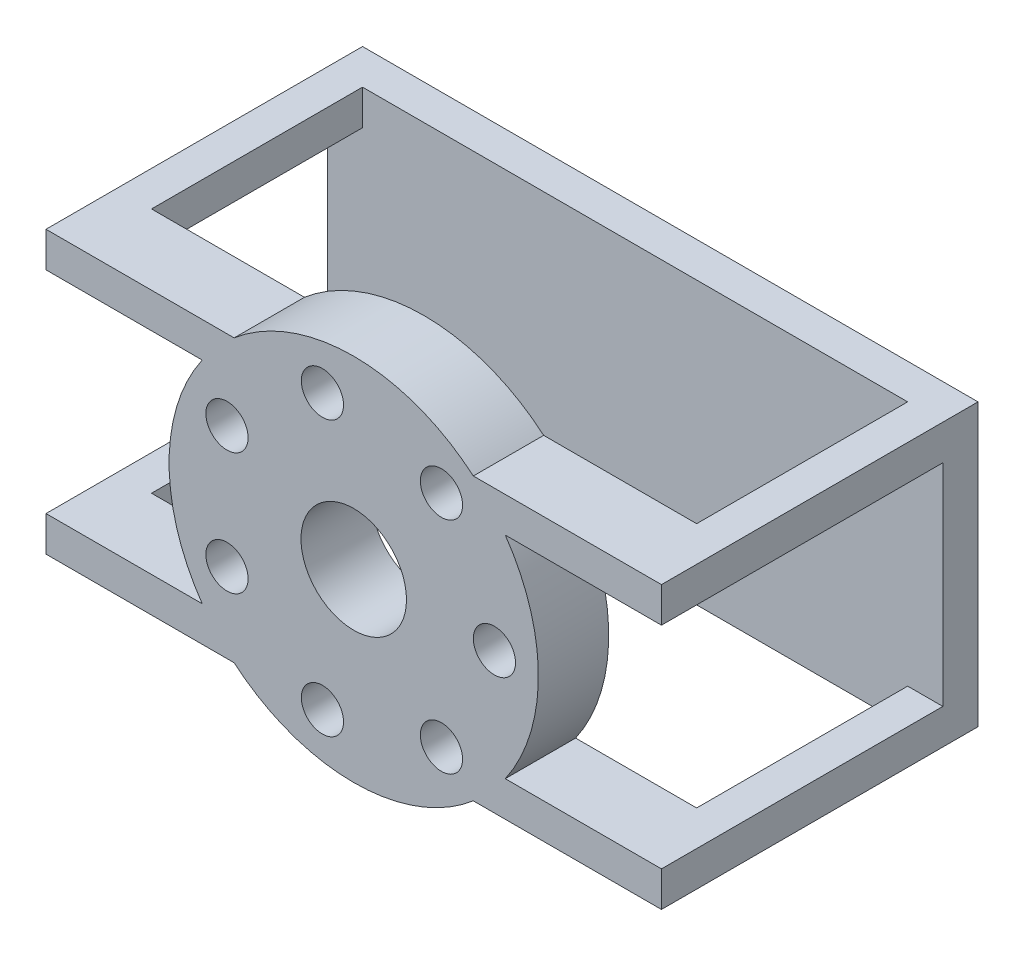
ISO-10303-21;
HEADER;
FILE_DESCRIPTION(('STEP AP214'),'2;1');
FILE_NAME('part.step','',(''),(''),'','','');
FILE_SCHEMA(('AUTOMOTIVE_DESIGN { 1 0 10303 214 1 1 1 1 }'));
ENDSEC;
DATA;
#1=APPLICATION_CONTEXT('core data for automotive mechanical design processes');
#2=APPLICATION_PROTOCOL_DEFINITION('international standard','automotive_design',2000,#1);
#3=PRODUCT_CONTEXT('',#1,'mechanical');
#4=PRODUCT('Part','Part','',(#3));
#5=PRODUCT_RELATED_PRODUCT_CATEGORY('part','',(#4));
#6=PRODUCT_DEFINITION_FORMATION('','',#4);
#7=PRODUCT_DEFINITION_CONTEXT('part definition',#1,'design');
#8=PRODUCT_DEFINITION('design','',#6,#7);
#9=PRODUCT_DEFINITION_SHAPE('','',#8);
#10=(LENGTH_UNIT() NAMED_UNIT(*) SI_UNIT(.MILLI.,.METRE.));
#11=(NAMED_UNIT(*) PLANE_ANGLE_UNIT() SI_UNIT($,.RADIAN.));
#12=(NAMED_UNIT(*) SI_UNIT($,.STERADIAN.) SOLID_ANGLE_UNIT());
#13=UNCERTAINTY_MEASURE_WITH_UNIT(LENGTH_MEASURE(1.E-05),#10,'distance_accuracy_value','');
#14=(GEOMETRIC_REPRESENTATION_CONTEXT(3) GLOBAL_UNCERTAINTY_ASSIGNED_CONTEXT((#13)) GLOBAL_UNIT_ASSIGNED_CONTEXT((#10,
#11,#12)) REPRESENTATION_CONTEXT('',''));
#15=CARTESIAN_POINT('',(0.,0.,0.));
#16=DIRECTION('',(0.,0.,1.));
#17=DIRECTION('',(1.,0.,0.));
#18=AXIS2_PLACEMENT_3D('',#15,#16,#17);
#19=CARTESIAN_POINT('',(87.5,52.5,0.));
#20=DIRECTION('',(0.,0.,-1.));
#21=DIRECTION('',(-1.,0.,0.));
#22=AXIS2_PLACEMENT_3D('',#19,#20,#21);
#23=PLANE('',#22);
#24=CARTESIAN_POINT('',(24.9395920743493,-31.2732592987212,0.));
#25=DIRECTION('',(0.,0.,1.));
#26=DIRECTION('',(1.,0.,0.));
#27=AXIS2_PLACEMENT_3D('',#24,#25,#26);
#28=CIRCLE('',#27,5.99999999999999);
#29=CARTESIAN_POINT('',(30.9395920743493,-31.2732592987212,0.));
#30=VERTEX_POINT('',#29);
#31=EDGE_CURVE('E500',#30,#30,#28,.T.);
#32=ORIENTED_EDGE('',*,*,#31,.F.);
#33=EDGE_LOOP('',(#32));
#34=FACE_BOUND('',#33,.T.);
#35=CARTESIAN_POINT('',(-8.90083735825273,-38.9971164872729,0.));
#36=DIRECTION('',(0.,0.,1.));
#37=DIRECTION('',(1.,0.,0.));
#38=AXIS2_PLACEMENT_3D('',#35,#36,#37);
#39=CIRCLE('',#38,6.);
#40=CARTESIAN_POINT('',(-2.90083735825273,-38.9971164872729,0.));
#41=VERTEX_POINT('',#40);
#42=EDGE_CURVE('E508',#41,#41,#39,.T.);
#43=ORIENTED_EDGE('',*,*,#42,.F.);
#44=EDGE_LOOP('',(#43));
#45=FACE_BOUND('',#44,.T.);
#46=CARTESIAN_POINT('',(-36.0387547160968,-17.3553495647023,0.));
#47=DIRECTION('',(0.,0.,1.));
#48=DIRECTION('',(1.,0.,0.));
#49=AXIS2_PLACEMENT_3D('',#46,#47,#48);
#50=CIRCLE('',#49,5.99999999999994);
#51=CARTESIAN_POINT('',(-30.0387547160968,-17.3553495647023,0.));
#52=VERTEX_POINT('',#51);
#53=EDGE_CURVE('E505',#52,#52,#50,.T.);
#54=ORIENTED_EDGE('',*,*,#53,.F.);
#55=EDGE_LOOP('',(#54));
#56=FACE_BOUND('',#55,.T.);
#57=CARTESIAN_POINT('',(40.,0.,0.));
#58=DIRECTION('',(0.,0.,1.));
#59=DIRECTION('',(1.,0.,0.));
#60=AXIS2_PLACEMENT_3D('',#57,#58,#59);
#61=CIRCLE('',#60,5.99999999999999);
#62=CARTESIAN_POINT('',(46.,0.,0.));
#63=VERTEX_POINT('',#62);
#64=EDGE_CURVE('E501',#63,#63,#61,.T.);
#65=ORIENTED_EDGE('',*,*,#64,.F.);
#66=EDGE_LOOP('',(#65));
#67=FACE_BOUND('',#66,.T.);
#68=CARTESIAN_POINT('',(-8.9008373582522,38.997116487273,0.));
#69=DIRECTION('',(0.,0.,1.));
#70=DIRECTION('',(1.,0.,0.));
#71=AXIS2_PLACEMENT_3D('',#68,#69,#70);
#72=CIRCLE('',#71,5.99999999999999);
#73=CARTESIAN_POINT('',(-2.90083735825221,38.997116487273,0.));
#74=VERTEX_POINT('',#73);
#75=EDGE_CURVE('E516',#74,#74,#72,.T.);
#76=ORIENTED_EDGE('',*,*,#75,.F.);
#77=EDGE_LOOP('',(#76));
#78=FACE_BOUND('',#77,.T.);
#79=CARTESIAN_POINT('',(24.9395920743497,31.2732592987209,0.));
#80=DIRECTION('',(0.,0.,1.));
#81=DIRECTION('',(1.,0.,0.));
#82=AXIS2_PLACEMENT_3D('',#79,#80,#81);
#83=CIRCLE('',#82,5.99999999999999);
#84=CARTESIAN_POINT('',(30.9395920743497,31.2732592987209,0.));
#85=VERTEX_POINT('',#84);
#86=EDGE_CURVE('E513',#85,#85,#83,.T.);
#87=ORIENTED_EDGE('',*,*,#86,.F.);
#88=EDGE_LOOP('',(#87));
#89=FACE_BOUND('',#88,.T.);
#90=CARTESIAN_POINT('',(-36.0387547160966,17.3553495647026,0.));
#91=DIRECTION('',(0.,0.,1.));
#92=DIRECTION('',(1.,0.,0.));
#93=AXIS2_PLACEMENT_3D('',#90,#91,#92);
#94=CIRCLE('',#93,6.);
#95=CARTESIAN_POINT('',(-30.0387547160966,17.3553495647026,0.));
#96=VERTEX_POINT('',#95);
#97=EDGE_CURVE('E504',#96,#96,#94,.T.);
#98=ORIENTED_EDGE('',*,*,#97,.F.);
#99=EDGE_LOOP('',(#98));
#100=FACE_BOUND('',#99,.T.);
#101=CARTESIAN_POINT('',(0.,0.,0.));
#102=DIRECTION('',(0.,0.,1.));
#103=DIRECTION('',(1.,0.,0.));
#104=AXIS2_PLACEMENT_3D('',#101,#102,#103);
#105=CIRCLE('',#104,15.);
#106=CARTESIAN_POINT('',(15.,0.,0.));
#107=VERTEX_POINT('',#106);
#108=EDGE_CURVE('E497',#107,#107,#105,.T.);
#109=ORIENTED_EDGE('',*,*,#108,.F.);
#110=EDGE_LOOP('',(#109));
#111=FACE_BOUND('',#110,.T.);
#112=DIRECTION('',(-1.,0.,0.));
#113=VECTOR('',#112,1.);
#114=CARTESIAN_POINT('',(0.,40.,0.));
#115=LINE('',#114,#113);
#116=CARTESIAN_POINT('',(87.5,40.,0.));
#117=VERTEX_POINT('',#116);
#118=CARTESIAN_POINT('',(34.0036762718386,40.,0.));
#119=VERTEX_POINT('',#118);
#120=EDGE_CURVE('E551',#117,#119,#115,.T.);
#121=ORIENTED_EDGE('',*,*,#120,.T.);
#122=CARTESIAN_POINT('',(0.,0.,0.));
#123=DIRECTION('',(0.,0.,1.));
#124=DIRECTION('',(1.,0.,0.));
#125=AXIS2_PLACEMENT_3D('',#122,#123,#124);
#126=CIRCLE('',#125,52.5);
#127=CARTESIAN_POINT('',(-34.0036762718386,40.,0.));
#128=VERTEX_POINT('',#127);
#129=EDGE_CURVE('E368',#119,#128,#126,.T.);
#130=ORIENTED_EDGE('',*,*,#129,.T.);
#131=DIRECTION('',(1.,0.,0.));
#132=VECTOR('',#131,1.);
#133=CARTESIAN_POINT('',(0.,40.,0.));
#134=LINE('',#133,#132);
#135=CARTESIAN_POINT('',(-87.5,40.,0.));
#136=VERTEX_POINT('',#135);
#137=EDGE_CURVE('E309',#136,#128,#134,.T.);
#138=ORIENTED_EDGE('',*,*,#137,.F.);
#139=DIRECTION('',(0.,-1.,0.));
#140=VECTOR('',#139,1.);
#141=CARTESIAN_POINT('',(-87.5,52.5,0.));
#142=LINE('',#141,#140);
#143=CARTESIAN_POINT('',(-87.5,30.,0.));
#144=VERTEX_POINT('',#143);
#145=EDGE_CURVE('E14',#136,#144,#142,.T.);
#146=ORIENTED_EDGE('',*,*,#145,.T.);
#147=DIRECTION('',(1.,0.,0.));
#148=VECTOR('',#147,1.);
#149=CARTESIAN_POINT('',(0.,30.,0.));
#150=LINE('',#149,#148);
#151=CARTESIAN_POINT('',(-43.0842198490352,30.,0.));
#152=VERTEX_POINT('',#151);
#153=EDGE_CURVE('E529',#144,#152,#150,.T.);
#154=ORIENTED_EDGE('',*,*,#153,.T.);
#155=CARTESIAN_POINT('',(0.,0.,0.));
#156=DIRECTION('',(0.,0.,1.));
#157=DIRECTION('',(1.,0.,0.));
#158=AXIS2_PLACEMENT_3D('',#155,#156,#157);
#159=CIRCLE('',#158,52.5);
#160=CARTESIAN_POINT('',(-43.0842198490352,-30.,0.));
#161=VERTEX_POINT('',#160);
#162=EDGE_CURVE('E152',#152,#161,#159,.T.);
#163=ORIENTED_EDGE('',*,*,#162,.T.);
#164=DIRECTION('',(1.,0.,0.));
#165=VECTOR('',#164,1.);
#166=CARTESIAN_POINT('',(0.,-30.,0.));
#167=LINE('',#166,#165);
#168=CARTESIAN_POINT('',(-87.5,-30.,0.));
#169=VERTEX_POINT('',#168);
#170=EDGE_CURVE('E522',#169,#161,#167,.T.);
#171=ORIENTED_EDGE('',*,*,#170,.F.);
#172=CARTESIAN_POINT('',(-87.5,-40.,0.));
#173=VERTEX_POINT('',#172);
#174=EDGE_CURVE('E141',#169,#173,#142,.T.);
#175=ORIENTED_EDGE('',*,*,#174,.T.);
#176=DIRECTION('',(1.,0.,0.));
#177=VECTOR('',#176,1.);
#178=CARTESIAN_POINT('',(0.,-40.,0.));
#179=LINE('',#178,#177);
#180=CARTESIAN_POINT('',(-34.0036762718386,-40.,0.));
#181=VERTEX_POINT('',#180);
#182=EDGE_CURVE('E320',#173,#181,#179,.T.);
#183=ORIENTED_EDGE('',*,*,#182,.T.);
#184=CARTESIAN_POINT('',(0.,0.,0.));
#185=DIRECTION('',(0.,0.,1.));
#186=DIRECTION('',(1.,0.,0.));
#187=AXIS2_PLACEMENT_3D('',#184,#185,#186);
#188=CIRCLE('',#187,52.5);
#189=CARTESIAN_POINT('',(34.0036762718386,-40.,0.));
#190=VERTEX_POINT('',#189);
#191=EDGE_CURVE('E359',#181,#190,#188,.T.);
#192=ORIENTED_EDGE('',*,*,#191,.T.);
#193=DIRECTION('',(-1.,0.,0.));
#194=VECTOR('',#193,1.);
#195=CARTESIAN_POINT('',(0.,-40.,0.));
#196=LINE('',#195,#194);
#197=CARTESIAN_POINT('',(87.5,-40.,0.));
#198=VERTEX_POINT('',#197);
#199=EDGE_CURVE('E357',#198,#190,#196,.T.);
#200=ORIENTED_EDGE('',*,*,#199,.F.);
#201=DIRECTION('',(0.,-1.,0.));
#202=VECTOR('',#201,1.);
#203=CARTESIAN_POINT('',(87.5,52.5,0.));
#204=LINE('',#203,#202);
#205=CARTESIAN_POINT('',(87.5,-30.,0.));
#206=VERTEX_POINT('',#205);
#207=EDGE_CURVE('E330',#206,#198,#204,.T.);
#208=ORIENTED_EDGE('',*,*,#207,.F.);
#209=DIRECTION('',(-1.,0.,0.));
#210=VECTOR('',#209,1.);
#211=CARTESIAN_POINT('',(0.,-30.,0.));
#212=LINE('',#211,#210);
#213=CARTESIAN_POINT('',(43.0842198490352,-30.,0.));
#214=VERTEX_POINT('',#213);
#215=EDGE_CURVE('E354',#206,#214,#212,.T.);
#216=ORIENTED_EDGE('',*,*,#215,.T.);
#217=CARTESIAN_POINT('',(0.,0.,0.));
#218=DIRECTION('',(0.,0.,1.));
#219=DIRECTION('',(1.,0.,0.));
#220=AXIS2_PLACEMENT_3D('',#217,#218,#219);
#221=CIRCLE('',#220,52.5);
#222=CARTESIAN_POINT('',(43.0842198490352,30.,0.));
#223=VERTEX_POINT('',#222);
#224=EDGE_CURVE('E378',#214,#223,#221,.T.);
#225=ORIENTED_EDGE('',*,*,#224,.T.);
#226=DIRECTION('',(-1.,0.,0.));
#227=VECTOR('',#226,1.);
#228=CARTESIAN_POINT('',(0.,30.,0.));
#229=LINE('',#228,#227);
#230=CARTESIAN_POINT('',(87.5,30.,0.));
#231=VERTEX_POINT('',#230);
#232=EDGE_CURVE('E372',#231,#223,#229,.T.);
#233=ORIENTED_EDGE('',*,*,#232,.F.);
#234=EDGE_CURVE('E336',#117,#231,#204,.T.);
#235=ORIENTED_EDGE('',*,*,#234,.F.);
#236=EDGE_LOOP('',(#121,#130,#138,#146,#154,#163,#171,#175,#183,#192,#200,#208,#216,#225,#233,#235));
#237=FACE_BOUND('',#236,.T.);
#238=ADVANCED_FACE('F137',(#34,#45,#56,#67,#78,#89,#100,#111,#237),#23,.F.);
#239=CARTESIAN_POINT('',(77.5,52.5,-20.));
#240=DIRECTION('',(0.,0.,-1.));
#241=DIRECTION('',(-1.,0.,0.));
#242=AXIS2_PLACEMENT_3D('',#239,#240,#241);
#243=PLANE('',#242);
#244=CARTESIAN_POINT('',(24.9395920743493,-31.2732592987212,-20.));
#245=DIRECTION('',(0.,0.,-1.));
#246=DIRECTION('',(-1.,0.,0.));
#247=AXIS2_PLACEMENT_3D('',#244,#245,#246);
#248=CIRCLE('',#247,5.99999999999999);
#249=CARTESIAN_POINT('',(18.9395920743493,-31.2732592987212,-20.));
#250=VERTEX_POINT('',#249);
#251=EDGE_CURVE('E451',#250,#250,#248,.T.);
#252=ORIENTED_EDGE('',*,*,#251,.F.);
#253=EDGE_LOOP('',(#252));
#254=FACE_BOUND('',#253,.T.);
#255=CARTESIAN_POINT('',(-8.90083735825273,-38.9971164872729,-20.));
#256=DIRECTION('',(0.,0.,-1.));
#257=DIRECTION('',(-1.,0.,0.));
#258=AXIS2_PLACEMENT_3D('',#255,#256,#257);
#259=CIRCLE('',#258,6.);
#260=CARTESIAN_POINT('',(-14.9008373582527,-38.9971164872729,-20.));
#261=VERTEX_POINT('',#260);
#262=EDGE_CURVE('E448',#261,#261,#259,.T.);
#263=ORIENTED_EDGE('',*,*,#262,.F.);
#264=EDGE_LOOP('',(#263));
#265=FACE_BOUND('',#264,.T.);
#266=CARTESIAN_POINT('',(-36.0387547160968,-17.3553495647023,-20.));
#267=DIRECTION('',(0.,0.,-1.));
#268=DIRECTION('',(-1.,0.,0.));
#269=AXIS2_PLACEMENT_3D('',#266,#267,#268);
#270=CIRCLE('',#269,5.99999999999994);
#271=CARTESIAN_POINT('',(-42.0387547160967,-17.3553495647023,-20.));
#272=VERTEX_POINT('',#271);
#273=EDGE_CURVE('E445',#272,#272,#270,.T.);
#274=ORIENTED_EDGE('',*,*,#273,.F.);
#275=EDGE_LOOP('',(#274));
#276=FACE_BOUND('',#275,.T.);
#277=CARTESIAN_POINT('',(40.,0.,-20.));
#278=DIRECTION('',(0.,0.,-1.));
#279=DIRECTION('',(-1.,0.,0.));
#280=AXIS2_PLACEMENT_3D('',#277,#278,#279);
#281=CIRCLE('',#280,5.99999999999999);
#282=CARTESIAN_POINT('',(34.,0.,-20.));
#283=VERTEX_POINT('',#282);
#284=EDGE_CURVE('E442',#283,#283,#281,.T.);
#285=ORIENTED_EDGE('',*,*,#284,.F.);
#286=EDGE_LOOP('',(#285));
#287=FACE_BOUND('',#286,.T.);
#288=CARTESIAN_POINT('',(-8.9008373582522,38.997116487273,-20.));
#289=DIRECTION('',(0.,0.,-1.));
#290=DIRECTION('',(-1.,0.,0.));
#291=AXIS2_PLACEMENT_3D('',#288,#289,#290);
#292=CIRCLE('',#291,5.99999999999999);
#293=CARTESIAN_POINT('',(-14.9008373582522,38.997116487273,-20.));
#294=VERTEX_POINT('',#293);
#295=EDGE_CURVE('E426',#294,#294,#292,.T.);
#296=ORIENTED_EDGE('',*,*,#295,.F.);
#297=EDGE_LOOP('',(#296));
#298=FACE_BOUND('',#297,.T.);
#299=CARTESIAN_POINT('',(24.9395920743497,31.2732592987209,-20.));
#300=DIRECTION('',(0.,0.,-1.));
#301=DIRECTION('',(-1.,0.,0.));
#302=AXIS2_PLACEMENT_3D('',#299,#300,#301);
#303=CIRCLE('',#302,5.99999999999999);
#304=CARTESIAN_POINT('',(18.9395920743497,31.2732592987209,-20.));
#305=VERTEX_POINT('',#304);
#306=EDGE_CURVE('E423',#305,#305,#303,.T.);
#307=ORIENTED_EDGE('',*,*,#306,.F.);
#308=EDGE_LOOP('',(#307));
#309=FACE_BOUND('',#308,.T.);
#310=CARTESIAN_POINT('',(-36.0387547160966,17.3553495647026,-20.));
#311=DIRECTION('',(0.,0.,-1.));
#312=DIRECTION('',(-1.,0.,0.));
#313=AXIS2_PLACEMENT_3D('',#310,#311,#312);
#314=CIRCLE('',#313,6.);
#315=CARTESIAN_POINT('',(-42.0387547160966,17.3553495647026,-20.));
#316=VERTEX_POINT('',#315);
#317=EDGE_CURVE('E420',#316,#316,#314,.T.);
#318=ORIENTED_EDGE('',*,*,#317,.F.);
#319=EDGE_LOOP('',(#318));
#320=FACE_BOUND('',#319,.T.);
#321=CARTESIAN_POINT('',(0.,0.,-20.));
#322=DIRECTION('',(0.,0.,-1.));
#323=DIRECTION('',(-1.,0.,0.));
#324=AXIS2_PLACEMENT_3D('',#321,#322,#323);
#325=CIRCLE('',#324,15.);
#326=CARTESIAN_POINT('',(-15.,0.,-20.));
#327=VERTEX_POINT('',#326);
#328=EDGE_CURVE('E417',#327,#327,#325,.T.);
#329=ORIENTED_EDGE('',*,*,#328,.F.);
#330=EDGE_LOOP('',(#329));
#331=FACE_BOUND('',#330,.T.);
#332=CARTESIAN_POINT('',(0.,0.,-20.));
#333=DIRECTION('',(0.,0.,-1.));
#334=DIRECTION('',(-1.,0.,0.));
#335=AXIS2_PLACEMENT_3D('',#332,#333,#334);
#336=CIRCLE('',#335,52.5);
#337=CARTESIAN_POINT('',(-34.0036762718386,40.,-20.));
#338=VERTEX_POINT('',#337);
#339=CARTESIAN_POINT('',(34.0036762718386,40.,-20.));
#340=VERTEX_POINT('',#339);
#341=EDGE_CURVE('E393',#338,#340,#336,.T.);
#342=ORIENTED_EDGE('',*,*,#341,.T.);
#343=DIRECTION('',(1.,0.,0.));
#344=VECTOR('',#343,1.);
#345=CARTESIAN_POINT('',(77.5,40.,-20.));
#346=LINE('',#345,#344);
#347=CARTESIAN_POINT('',(77.5,40.,-20.));
#348=VERTEX_POINT('',#347);
#349=EDGE_CURVE('E491',#340,#348,#346,.T.);
#350=ORIENTED_EDGE('',*,*,#349,.T.);
#351=DIRECTION('',(0.,-1.,0.));
#352=VECTOR('',#351,1.);
#353=CARTESIAN_POINT('',(77.5,52.5,-20.));
#354=LINE('',#353,#352);
#355=CARTESIAN_POINT('',(77.5,30.,-20.));
#356=VERTEX_POINT('',#355);
#357=EDGE_CURVE('E461',#348,#356,#354,.T.);
#358=ORIENTED_EDGE('',*,*,#357,.T.);
#359=DIRECTION('',(1.,0.,0.));
#360=VECTOR('',#359,1.);
#361=CARTESIAN_POINT('',(77.5,30.,-20.));
#362=LINE('',#361,#360);
#363=CARTESIAN_POINT('',(43.0842198490352,30.,-20.));
#364=VERTEX_POINT('',#363);
#365=EDGE_CURVE('E411',#364,#356,#362,.T.);
#366=ORIENTED_EDGE('',*,*,#365,.F.);
#367=CARTESIAN_POINT('',(0.,0.,-20.));
#368=DIRECTION('',(0.,0.,-1.));
#369=DIRECTION('',(-1.,0.,0.));
#370=AXIS2_PLACEMENT_3D('',#367,#368,#369);
#371=CIRCLE('',#370,52.5);
#372=CARTESIAN_POINT('',(43.0842198490352,-30.,-20.));
#373=VERTEX_POINT('',#372);
#374=EDGE_CURVE('E414',#364,#373,#371,.T.);
#375=ORIENTED_EDGE('',*,*,#374,.T.);
#376=DIRECTION('',(1.,0.,0.));
#377=VECTOR('',#376,1.);
#378=CARTESIAN_POINT('',(77.5,-30.,-20.));
#379=LINE('',#378,#377);
#380=CARTESIAN_POINT('',(77.5,-30.,-20.));
#381=VERTEX_POINT('',#380);
#382=EDGE_CURVE('E405',#373,#381,#379,.T.);
#383=ORIENTED_EDGE('',*,*,#382,.T.);
#384=CARTESIAN_POINT('',(77.5,-40.,-20.));
#385=VERTEX_POINT('',#384);
#386=EDGE_CURVE('E459',#381,#385,#354,.T.);
#387=ORIENTED_EDGE('',*,*,#386,.T.);
#388=DIRECTION('',(1.,0.,0.));
#389=VECTOR('',#388,1.);
#390=CARTESIAN_POINT('',(77.5,-40.,-20.));
#391=LINE('',#390,#389);
#392=CARTESIAN_POINT('',(34.0036762718386,-40.,-20.));
#393=VERTEX_POINT('',#392);
#394=EDGE_CURVE('E398',#393,#385,#391,.T.);
#395=ORIENTED_EDGE('',*,*,#394,.F.);
#396=CARTESIAN_POINT('',(0.,0.,-20.));
#397=DIRECTION('',(0.,0.,-1.));
#398=DIRECTION('',(-1.,0.,0.));
#399=AXIS2_PLACEMENT_3D('',#396,#397,#398);
#400=CIRCLE('',#399,52.5);
#401=CARTESIAN_POINT('',(-34.0036762718386,-40.,-20.));
#402=VERTEX_POINT('',#401);
#403=EDGE_CURVE('E400',#393,#402,#400,.T.);
#404=ORIENTED_EDGE('',*,*,#403,.T.);
#405=DIRECTION('',(-1.,0.,0.));
#406=VECTOR('',#405,1.);
#407=CARTESIAN_POINT('',(77.5,-40.,-20.));
#408=LINE('',#407,#406);
#409=CARTESIAN_POINT('',(-77.5,-40.,-20.));
#410=VERTEX_POINT('',#409);
#411=EDGE_CURVE('E486',#402,#410,#408,.T.);
#412=ORIENTED_EDGE('',*,*,#411,.T.);
#413=DIRECTION('',(0.,-1.,0.));
#414=VECTOR('',#413,1.);
#415=CARTESIAN_POINT('',(-77.5,52.5,-20.));
#416=LINE('',#415,#414);
#417=CARTESIAN_POINT('',(-77.5,-30.,-20.));
#418=VERTEX_POINT('',#417);
#419=EDGE_CURVE('E333',#418,#410,#416,.T.);
#420=ORIENTED_EDGE('',*,*,#419,.F.);
#421=DIRECTION('',(-1.,0.,0.));
#422=VECTOR('',#421,1.);
#423=CARTESIAN_POINT('',(77.5,-30.,-20.));
#424=LINE('',#423,#422);
#425=CARTESIAN_POINT('',(-43.0842198490352,-30.,-20.));
#426=VERTEX_POINT('',#425);
#427=EDGE_CURVE('E435',#426,#418,#424,.T.);
#428=ORIENTED_EDGE('',*,*,#427,.F.);
#429=CARTESIAN_POINT('',(0.,0.,-20.));
#430=DIRECTION('',(0.,0.,-1.));
#431=DIRECTION('',(-1.,0.,0.));
#432=AXIS2_PLACEMENT_3D('',#429,#430,#431);
#433=CIRCLE('',#432,52.5);
#434=CARTESIAN_POINT('',(-43.0842198490352,30.,-20.));
#435=VERTEX_POINT('',#434);
#436=EDGE_CURVE('E439',#426,#435,#433,.T.);
#437=ORIENTED_EDGE('',*,*,#436,.T.);
#438=DIRECTION('',(-1.,0.,0.));
#439=VECTOR('',#438,1.);
#440=CARTESIAN_POINT('',(77.5,30.,-20.));
#441=LINE('',#440,#439);
#442=CARTESIAN_POINT('',(-77.5,30.,-20.));
#443=VERTEX_POINT('',#442);
#444=EDGE_CURVE('E429',#435,#443,#441,.T.);
#445=ORIENTED_EDGE('',*,*,#444,.T.);
#446=CARTESIAN_POINT('',(-77.5,40.,-20.));
#447=VERTEX_POINT('',#446);
#448=EDGE_CURVE('E328',#447,#443,#416,.T.);
#449=ORIENTED_EDGE('',*,*,#448,.F.);
#450=DIRECTION('',(-1.,0.,0.));
#451=VECTOR('',#450,1.);
#452=CARTESIAN_POINT('',(77.5,40.,-20.));
#453=LINE('',#452,#451);
#454=EDGE_CURVE('E389',#338,#447,#453,.T.);
#455=ORIENTED_EDGE('',*,*,#454,.F.);
#456=EDGE_LOOP('',(#342,#350,#358,#366,#375,#383,#387,#395,#404,#412,#420,#428,#437,#445,#449,#455));
#457=FACE_BOUND('',#456,.T.);
#458=ADVANCED_FACE('F470',(#254,#265,#276,#287,#298,#309,#320,#331,#457),#243,.T.);
#459=CARTESIAN_POINT('',(-87.5,52.5,-90.));
#460=DIRECTION('',(1.,0.,0.));
#461=DIRECTION('',(0.,0.,-1.));
#462=AXIS2_PLACEMENT_3D('',#459,#460,#461);
#463=PLANE('',#462);
#464=DIRECTION('',(0.,0.,1.));
#465=VECTOR('',#464,1.);
#466=CARTESIAN_POINT('',(-87.5,40.,-80.));
#467=LINE('',#466,#465);
#468=CARTESIAN_POINT('',(-87.5,40.,-90.));
#469=VERTEX_POINT('',#468);
#470=EDGE_CURVE('E299',#469,#136,#467,.T.);
#471=ORIENTED_EDGE('',*,*,#470,.F.);
#472=DIRECTION('',(0.,-1.,0.));
#473=VECTOR('',#472,1.);
#474=CARTESIAN_POINT('',(-87.5,52.5,-90.));
#475=LINE('',#474,#473);
#476=CARTESIAN_POINT('',(-87.5,-40.,-90.));
#477=VERTEX_POINT('',#476);
#478=EDGE_CURVE('E303',#469,#477,#475,.T.);
#479=ORIENTED_EDGE('',*,*,#478,.T.);
#480=DIRECTION('',(0.,0.,1.));
#481=VECTOR('',#480,1.);
#482=CARTESIAN_POINT('',(-87.5,-40.,-80.));
#483=LINE('',#482,#481);
#484=EDGE_CURVE('E554',#477,#173,#483,.T.);
#485=ORIENTED_EDGE('',*,*,#484,.T.);
#486=ORIENTED_EDGE('',*,*,#174,.F.);
#487=DIRECTION('',(0.,0.,1.));
#488=VECTOR('',#487,1.);
#489=CARTESIAN_POINT('',(-87.5,-30.,-80.));
#490=LINE('',#489,#488);
#491=CARTESIAN_POINT('',(-87.5,-30.,-80.));
#492=VERTEX_POINT('',#491);
#493=EDGE_CURVE('E535',#492,#169,#490,.T.);
#494=ORIENTED_EDGE('',*,*,#493,.F.);
#495=DIRECTION('',(0.,-1.,0.));
#496=VECTOR('',#495,1.);
#497=CARTESIAN_POINT('',(-87.5,0.,-80.));
#498=LINE('',#497,#496);
#499=CARTESIAN_POINT('',(-87.5,30.,-80.));
#500=VERTEX_POINT('',#499);
#501=EDGE_CURVE('E521',#500,#492,#498,.T.);
#502=ORIENTED_EDGE('',*,*,#501,.F.);
#503=DIRECTION('',(0.,0.,1.));
#504=VECTOR('',#503,1.);
#505=CARTESIAN_POINT('',(-87.5,30.,-80.));
#506=LINE('',#505,#504);
#507=EDGE_CURVE('E537',#500,#144,#506,.T.);
#508=ORIENTED_EDGE('',*,*,#507,.T.);
#509=ORIENTED_EDGE('',*,*,#145,.F.);
#510=EDGE_LOOP('',(#471,#479,#485,#486,#494,#502,#508,#509));
#511=FACE_BOUND('',#510,.T.);
#512=ADVANCED_FACE('F139',(#511),#463,.F.);
#513=CARTESIAN_POINT('',(87.5,52.5,-90.));
#514=DIRECTION('',(-1.,0.,0.));
#515=DIRECTION('',(0.,0.,1.));
#516=AXIS2_PLACEMENT_3D('',#513,#514,#515);
#517=PLANE('',#516);
#518=DIRECTION('',(0.,-1.,0.));
#519=VECTOR('',#518,1.);
#520=CARTESIAN_POINT('',(87.5,52.5,-90.));
#521=LINE('',#520,#519);
#522=CARTESIAN_POINT('',(87.5,40.,-90.));
#523=VERTEX_POINT('',#522);
#524=CARTESIAN_POINT('',(87.5,-40.,-90.));
#525=VERTEX_POINT('',#524);
#526=EDGE_CURVE('E327',#523,#525,#521,.T.);
#527=ORIENTED_EDGE('',*,*,#526,.F.);
#528=DIRECTION('',(0.,0.,1.));
#529=VECTOR('',#528,1.);
#530=CARTESIAN_POINT('',(87.5,40.,-80.));
#531=LINE('',#530,#529);
#532=EDGE_CURVE('E316',#523,#117,#531,.T.);
#533=ORIENTED_EDGE('',*,*,#532,.T.);
#534=ORIENTED_EDGE('',*,*,#234,.T.);
#535=DIRECTION('',(0.,0.,1.));
#536=VECTOR('',#535,1.);
#537=CARTESIAN_POINT('',(87.5,30.,-80.));
#538=LINE('',#537,#536);
#539=CARTESIAN_POINT('',(87.5,30.,-80.));
#540=VERTEX_POINT('',#539);
#541=EDGE_CURVE('E385',#540,#231,#538,.T.);
#542=ORIENTED_EDGE('',*,*,#541,.F.);
#543=DIRECTION('',(0.,1.,0.));
#544=VECTOR('',#543,1.);
#545=CARTESIAN_POINT('',(87.5,0.,-80.));
#546=LINE('',#545,#544);
#547=CARTESIAN_POINT('',(87.5,-30.,-80.));
#548=VERTEX_POINT('',#547);
#549=EDGE_CURVE('E371',#548,#540,#546,.T.);
#550=ORIENTED_EDGE('',*,*,#549,.F.);
#551=DIRECTION('',(0.,0.,1.));
#552=VECTOR('',#551,1.);
#553=CARTESIAN_POINT('',(87.5,-30.,-80.));
#554=LINE('',#553,#552);
#555=EDGE_CURVE('E348',#548,#206,#554,.T.);
#556=ORIENTED_EDGE('',*,*,#555,.T.);
#557=ORIENTED_EDGE('',*,*,#207,.T.);
#558=DIRECTION('',(0.,0.,1.));
#559=VECTOR('',#558,1.);
#560=CARTESIAN_POINT('',(87.5,-40.,-80.));
#561=LINE('',#560,#559);
#562=EDGE_CURVE('E346',#525,#198,#561,.T.);
#563=ORIENTED_EDGE('',*,*,#562,.F.);
#564=EDGE_LOOP('',(#527,#533,#534,#542,#550,#556,#557,#563));
#565=FACE_BOUND('',#564,.T.);
#566=ADVANCED_FACE('F345',(#565),#517,.F.);
#567=CARTESIAN_POINT('',(-77.5,52.5,-80.));
#568=DIRECTION('',(1.,0.,0.));
#569=DIRECTION('',(0.,0.,-1.));
#570=AXIS2_PLACEMENT_3D('',#567,#568,#569);
#571=PLANE('',#570);
#572=ORIENTED_EDGE('',*,*,#419,.T.);
#573=DIRECTION('',(0.,0.,-1.));
#574=VECTOR('',#573,1.);
#575=CARTESIAN_POINT('',(-77.5,-40.,-80.));
#576=LINE('',#575,#574);
#577=CARTESIAN_POINT('',(-77.5,-40.,-80.));
#578=VERTEX_POINT('',#577);
#579=EDGE_CURVE('E487',#410,#578,#576,.T.);
#580=ORIENTED_EDGE('',*,*,#579,.T.);
#581=DIRECTION('',(0.,-1.,0.));
#582=VECTOR('',#581,1.);
#583=CARTESIAN_POINT('',(-77.5,52.5,-80.));
#584=LINE('',#583,#582);
#585=CARTESIAN_POINT('',(-77.5,-30.,-80.));
#586=VERTEX_POINT('',#585);
#587=EDGE_CURVE('E454',#586,#578,#584,.T.);
#588=ORIENTED_EDGE('',*,*,#587,.F.);
#589=DIRECTION('',(0.,0.,-1.));
#590=VECTOR('',#589,1.);
#591=CARTESIAN_POINT('',(-77.5,-30.,-80.));
#592=LINE('',#591,#590);
#593=EDGE_CURVE('E437',#418,#586,#592,.T.);
#594=ORIENTED_EDGE('',*,*,#593,.F.);
#595=EDGE_LOOP('',(#572,#580,#588,#594));
#596=FACE_BOUND('',#595,.T.);
#597=ADVANCED_FACE('F579',(#596),#571,.T.);
#598=CARTESIAN_POINT('',(77.5,52.5,-80.));
#599=DIRECTION('',(-1.,0.,0.));
#600=DIRECTION('',(0.,0.,1.));
#601=AXIS2_PLACEMENT_3D('',#598,#599,#600);
#602=PLANE('',#601);
#603=ORIENTED_EDGE('',*,*,#357,.F.);
#604=DIRECTION('',(0.,0.,-1.));
#605=VECTOR('',#604,1.);
#606=CARTESIAN_POINT('',(77.5,40.,-80.));
#607=LINE('',#606,#605);
#608=CARTESIAN_POINT('',(77.5,40.,-80.));
#609=VERTEX_POINT('',#608);
#610=EDGE_CURVE('E488',#348,#609,#607,.T.);
#611=ORIENTED_EDGE('',*,*,#610,.T.);
#612=DIRECTION('',(0.,-1.,0.));
#613=VECTOR('',#612,1.);
#614=CARTESIAN_POINT('',(77.5,52.5,-80.));
#615=LINE('',#614,#613);
#616=CARTESIAN_POINT('',(77.5,30.,-80.));
#617=VERTEX_POINT('',#616);
#618=EDGE_CURVE('E458',#609,#617,#615,.T.);
#619=ORIENTED_EDGE('',*,*,#618,.T.);
#620=DIRECTION('',(0.,0.,-1.));
#621=VECTOR('',#620,1.);
#622=CARTESIAN_POINT('',(77.5,30.,-80.));
#623=LINE('',#622,#621);
#624=EDGE_CURVE('E408',#356,#617,#623,.T.);
#625=ORIENTED_EDGE('',*,*,#624,.F.);
#626=EDGE_LOOP('',(#603,#611,#619,#625));
#627=FACE_BOUND('',#626,.T.);
#628=ADVANCED_FACE('F590',(#627),#602,.T.);
#629=ORIENTED_EDGE('',*,*,#448,.T.);
#630=DIRECTION('',(0.,0.,-1.));
#631=VECTOR('',#630,1.);
#632=CARTESIAN_POINT('',(-77.5,30.,-80.));
#633=LINE('',#632,#631);
#634=CARTESIAN_POINT('',(-77.5,30.,-80.));
#635=VERTEX_POINT('',#634);
#636=EDGE_CURVE('E432',#443,#635,#633,.T.);
#637=ORIENTED_EDGE('',*,*,#636,.T.);
#638=CARTESIAN_POINT('',(-77.5,40.,-80.));
#639=VERTEX_POINT('',#638);
#640=EDGE_CURVE('E457',#639,#635,#584,.T.);
#641=ORIENTED_EDGE('',*,*,#640,.F.);
#642=DIRECTION('',(0.,0.,-1.));
#643=VECTOR('',#642,1.);
#644=CARTESIAN_POINT('',(-77.5,40.,-80.));
#645=LINE('',#644,#643);
#646=EDGE_CURVE('E391',#447,#639,#645,.T.);
#647=ORIENTED_EDGE('',*,*,#646,.F.);
#648=EDGE_LOOP('',(#629,#637,#641,#647));
#649=FACE_BOUND('',#648,.T.);
#650=ADVANCED_FACE('F584',(#649),#571,.T.);
#651=ORIENTED_EDGE('',*,*,#386,.F.);
#652=DIRECTION('',(0.,0.,-1.));
#653=VECTOR('',#652,1.);
#654=CARTESIAN_POINT('',(77.5,-30.,-80.));
#655=LINE('',#654,#653);
#656=CARTESIAN_POINT('',(77.5,-30.,-80.));
#657=VERTEX_POINT('',#656);
#658=EDGE_CURVE('E402',#381,#657,#655,.T.);
#659=ORIENTED_EDGE('',*,*,#658,.T.);
#660=CARTESIAN_POINT('',(77.5,-40.,-80.));
#661=VERTEX_POINT('',#660);
#662=EDGE_CURVE('E460',#657,#661,#615,.T.);
#663=ORIENTED_EDGE('',*,*,#662,.T.);
#664=DIRECTION('',(0.,0.,-1.));
#665=VECTOR('',#664,1.);
#666=CARTESIAN_POINT('',(77.5,-40.,-80.));
#667=LINE('',#666,#665);
#668=EDGE_CURVE('E395',#385,#661,#667,.T.);
#669=ORIENTED_EDGE('',*,*,#668,.F.);
#670=EDGE_LOOP('',(#651,#659,#663,#669));
#671=FACE_BOUND('',#670,.T.);
#672=ADVANCED_FACE('F473',(#671),#602,.T.);
#673=CARTESIAN_POINT('',(87.5,52.5,-90.));
#674=DIRECTION('',(0.,0.,1.));
#675=DIRECTION('',(1.,0.,0.));
#676=AXIS2_PLACEMENT_3D('',#673,#674,#675);
#677=PLANE('',#676);
#678=ORIENTED_EDGE('',*,*,#478,.F.);
#679=DIRECTION('',(-1.,0.,0.));
#680=VECTOR('',#679,1.);
#681=CARTESIAN_POINT('',(-87.5,40.,-90.));
#682=LINE('',#681,#680);
#683=EDGE_CURVE('E312',#523,#469,#682,.T.);
#684=ORIENTED_EDGE('',*,*,#683,.F.);
#685=ORIENTED_EDGE('',*,*,#526,.T.);
#686=DIRECTION('',(1.,0.,0.));
#687=VECTOR('',#686,1.);
#688=CARTESIAN_POINT('',(-87.5,-40.,-90.));
#689=LINE('',#688,#687);
#690=EDGE_CURVE('E326',#477,#525,#689,.T.);
#691=ORIENTED_EDGE('',*,*,#690,.F.);
#692=EDGE_LOOP('',(#678,#684,#685,#691));
#693=FACE_BOUND('',#692,.T.);
#694=ADVANCED_FACE('F324',(#693),#677,.F.);
#695=CARTESIAN_POINT('',(77.5,52.5,-80.));
#696=DIRECTION('',(0.,0.,1.));
#697=DIRECTION('',(1.,0.,0.));
#698=AXIS2_PLACEMENT_3D('',#695,#696,#697);
#699=PLANE('',#698);
#700=DIRECTION('',(1.,0.,0.));
#701=VECTOR('',#700,1.);
#702=CARTESIAN_POINT('',(-87.5,40.,-80.));
#703=LINE('',#702,#701);
#704=EDGE_CURVE('E321',#639,#609,#703,.T.);
#705=ORIENTED_EDGE('',*,*,#704,.F.);
#706=ORIENTED_EDGE('',*,*,#640,.T.);
#707=DIRECTION('',(1.,0.,0.));
#708=VECTOR('',#707,1.);
#709=CARTESIAN_POINT('',(0.,30.,-80.));
#710=LINE('',#709,#708);
#711=EDGE_CURVE('E519',#500,#635,#710,.T.);
#712=ORIENTED_EDGE('',*,*,#711,.F.);
#713=ORIENTED_EDGE('',*,*,#501,.T.);
#714=DIRECTION('',(1.,0.,0.));
#715=VECTOR('',#714,1.);
#716=CARTESIAN_POINT('',(0.,-30.,-80.));
#717=LINE('',#716,#715);
#718=EDGE_CURVE('E524',#492,#586,#717,.T.);
#719=ORIENTED_EDGE('',*,*,#718,.T.);
#720=ORIENTED_EDGE('',*,*,#587,.T.);
#721=DIRECTION('',(-1.,0.,0.));
#722=VECTOR('',#721,1.);
#723=CARTESIAN_POINT('',(-87.5,-40.,-80.));
#724=LINE('',#723,#722);
#725=EDGE_CURVE('E476',#661,#578,#724,.T.);
#726=ORIENTED_EDGE('',*,*,#725,.F.);
#727=ORIENTED_EDGE('',*,*,#662,.F.);
#728=DIRECTION('',(-1.,0.,0.));
#729=VECTOR('',#728,1.);
#730=CARTESIAN_POINT('',(0.,-30.,-80.));
#731=LINE('',#730,#729);
#732=EDGE_CURVE('E160',#548,#657,#731,.T.);
#733=ORIENTED_EDGE('',*,*,#732,.F.);
#734=ORIENTED_EDGE('',*,*,#549,.T.);
#735=DIRECTION('',(-1.,0.,0.));
#736=VECTOR('',#735,1.);
#737=CARTESIAN_POINT('',(0.,30.,-80.));
#738=LINE('',#737,#736);
#739=EDGE_CURVE('E374',#540,#617,#738,.T.);
#740=ORIENTED_EDGE('',*,*,#739,.T.);
#741=ORIENTED_EDGE('',*,*,#618,.F.);
#742=EDGE_LOOP('',(#705,#706,#712,#713,#719,#720,#726,#727,#733,#734,#740,#741));
#743=FACE_BOUND('',#742,.T.);
#744=ADVANCED_FACE('F580',(#743),#699,.T.);
#745=CARTESIAN_POINT('',(0.,0.,-80.));
#746=DIRECTION('',(0.,0.,1.));
#747=DIRECTION('',(1.,0.,0.));
#748=AXIS2_PLACEMENT_3D('',#745,#746,#747);
#749=CYLINDRICAL_SURFACE('',#748,52.5);
#750=DIRECTION('',(0.,0.,1.));
#751=VECTOR('',#750,1.);
#752=CARTESIAN_POINT('',(34.0036762718386,-40.,-80.));
#753=LINE('',#752,#751);
#754=EDGE_CURVE('E363',#393,#190,#753,.T.);
#755=ORIENTED_EDGE('',*,*,#754,.T.);
#756=ORIENTED_EDGE('',*,*,#191,.F.);
#757=DIRECTION('',(0.,0.,1.));
#758=VECTOR('',#757,1.);
#759=CARTESIAN_POINT('',(-34.0036762718386,-40.,-80.));
#760=LINE('',#759,#758);
#761=EDGE_CURVE('E482',#402,#181,#760,.T.);
#762=ORIENTED_EDGE('',*,*,#761,.F.);
#763=ORIENTED_EDGE('',*,*,#403,.F.);
#764=EDGE_LOOP('',(#755,#756,#762,#763));
#765=FACE_BOUND('',#764,.T.);
#766=ADVANCED_FACE('F479',(#765),#749,.T.);
#767=CARTESIAN_POINT('',(0.,-40.,-80.));
#768=DIRECTION('',(0.,1.,0.));
#769=DIRECTION('',(-1.,0.,0.));
#770=AXIS2_PLACEMENT_3D('',#767,#768,#769);
#771=PLANE('',#770);
#772=ORIENTED_EDGE('',*,*,#394,.T.);
#773=ORIENTED_EDGE('',*,*,#668,.T.);
#774=ORIENTED_EDGE('',*,*,#725,.T.);
#775=ORIENTED_EDGE('',*,*,#579,.F.);
#776=ORIENTED_EDGE('',*,*,#411,.F.);
#777=ORIENTED_EDGE('',*,*,#761,.T.);
#778=ORIENTED_EDGE('',*,*,#182,.F.);
#779=ORIENTED_EDGE('',*,*,#484,.F.);
#780=ORIENTED_EDGE('',*,*,#690,.T.);
#781=ORIENTED_EDGE('',*,*,#562,.T.);
#782=ORIENTED_EDGE('',*,*,#199,.T.);
#783=ORIENTED_EDGE('',*,*,#754,.F.);
#784=EDGE_LOOP('',(#772,#773,#774,#775,#776,#777,#778,#779,#780,#781,#782,#783));
#785=FACE_BOUND('',#784,.T.);
#786=ADVANCED_FACE('F475',(#785),#771,.F.);
#787=CARTESIAN_POINT('',(0.,0.,-80.));
#788=DIRECTION('',(0.,0.,1.));
#789=DIRECTION('',(1.,0.,0.));
#790=AXIS2_PLACEMENT_3D('',#787,#788,#789);
#791=CYLINDRICAL_SURFACE('',#790,52.5);
#792=DIRECTION('',(0.,0.,1.));
#793=VECTOR('',#792,1.);
#794=CARTESIAN_POINT('',(43.0842198490352,30.,-80.));
#795=LINE('',#794,#793);
#796=EDGE_CURVE('E365',#364,#223,#795,.T.);
#797=ORIENTED_EDGE('',*,*,#796,.T.);
#798=ORIENTED_EDGE('',*,*,#224,.F.);
#799=DIRECTION('',(0.,0.,1.));
#800=VECTOR('',#799,1.);
#801=CARTESIAN_POINT('',(43.0842198490352,-30.,-80.));
#802=LINE('',#801,#800);
#803=EDGE_CURVE('E377',#373,#214,#802,.T.);
#804=ORIENTED_EDGE('',*,*,#803,.F.);
#805=ORIENTED_EDGE('',*,*,#374,.F.);
#806=EDGE_LOOP('',(#797,#798,#804,#805));
#807=FACE_BOUND('',#806,.T.);
#808=ADVANCED_FACE('F598',(#807),#791,.T.);
#809=CARTESIAN_POINT('',(0.,30.,-80.));
#810=DIRECTION('',(0.,1.,0.));
#811=DIRECTION('',(0.,0.,1.));
#812=AXIS2_PLACEMENT_3D('',#809,#810,#811);
#813=PLANE('',#812);
#814=ORIENTED_EDGE('',*,*,#365,.T.);
#815=ORIENTED_EDGE('',*,*,#624,.T.);
#816=ORIENTED_EDGE('',*,*,#739,.F.);
#817=ORIENTED_EDGE('',*,*,#541,.T.);
#818=ORIENTED_EDGE('',*,*,#232,.T.);
#819=ORIENTED_EDGE('',*,*,#796,.F.);
#820=EDGE_LOOP('',(#814,#815,#816,#817,#818,#819));
#821=FACE_BOUND('',#820,.T.);
#822=ADVANCED_FACE('F594',(#821),#813,.F.);
#823=CARTESIAN_POINT('',(0.,-30.,-80.));
#824=DIRECTION('',(0.,1.,0.));
#825=DIRECTION('',(0.,0.,1.));
#826=AXIS2_PLACEMENT_3D('',#823,#824,#825);
#827=PLANE('',#826);
#828=ORIENTED_EDGE('',*,*,#803,.T.);
#829=ORIENTED_EDGE('',*,*,#215,.F.);
#830=ORIENTED_EDGE('',*,*,#555,.F.);
#831=ORIENTED_EDGE('',*,*,#732,.T.);
#832=ORIENTED_EDGE('',*,*,#658,.F.);
#833=ORIENTED_EDGE('',*,*,#382,.F.);
#834=EDGE_LOOP('',(#828,#829,#830,#831,#832,#833));
#835=FACE_BOUND('',#834,.T.);
#836=ADVANCED_FACE('F601',(#835),#827,.T.);
#837=CARTESIAN_POINT('',(0.,0.,-80.));
#838=DIRECTION('',(0.,0.,1.));
#839=DIRECTION('',(1.,0.,0.));
#840=AXIS2_PLACEMENT_3D('',#837,#838,#839);
#841=CYLINDRICAL_SURFACE('',#840,52.5);
#842=DIRECTION('',(0.,0.,1.));
#843=VECTOR('',#842,1.);
#844=CARTESIAN_POINT('',(-34.0036762718386,40.,-80.));
#845=LINE('',#844,#843);
#846=EDGE_CURVE('E308',#338,#128,#845,.T.);
#847=ORIENTED_EDGE('',*,*,#846,.T.);
#848=ORIENTED_EDGE('',*,*,#129,.F.);
#849=DIRECTION('',(0.,0.,1.));
#850=VECTOR('',#849,1.);
#851=CARTESIAN_POINT('',(34.0036762718386,40.,-80.));
#852=LINE('',#851,#850);
#853=EDGE_CURVE('E553',#340,#119,#852,.T.);
#854=ORIENTED_EDGE('',*,*,#853,.F.);
#855=ORIENTED_EDGE('',*,*,#341,.F.);
#856=EDGE_LOOP('',(#847,#848,#854,#855));
#857=FACE_BOUND('',#856,.T.);
#858=ADVANCED_FACE('F547',(#857),#841,.T.);
#859=CARTESIAN_POINT('',(0.,40.,-80.));
#860=DIRECTION('',(0.,-1.,0.));
#861=DIRECTION('',(1.,0.,0.));
#862=AXIS2_PLACEMENT_3D('',#859,#860,#861);
#863=PLANE('',#862);
#864=ORIENTED_EDGE('',*,*,#646,.T.);
#865=ORIENTED_EDGE('',*,*,#704,.T.);
#866=ORIENTED_EDGE('',*,*,#610,.F.);
#867=ORIENTED_EDGE('',*,*,#349,.F.);
#868=ORIENTED_EDGE('',*,*,#853,.T.);
#869=ORIENTED_EDGE('',*,*,#120,.F.);
#870=ORIENTED_EDGE('',*,*,#532,.F.);
#871=ORIENTED_EDGE('',*,*,#683,.T.);
#872=ORIENTED_EDGE('',*,*,#470,.T.);
#873=ORIENTED_EDGE('',*,*,#137,.T.);
#874=ORIENTED_EDGE('',*,*,#846,.F.);
#875=ORIENTED_EDGE('',*,*,#454,.T.);
#876=EDGE_LOOP('',(#864,#865,#866,#867,#868,#869,#870,#871,#872,#873,#874,#875));
#877=FACE_BOUND('',#876,.T.);
#878=ADVANCED_FACE('F314',(#877),#863,.F.);
#879=CARTESIAN_POINT('',(0.,0.,-80.));
#880=DIRECTION('',(0.,0.,1.));
#881=DIRECTION('',(1.,0.,0.));
#882=AXIS2_PLACEMENT_3D('',#879,#880,#881);
#883=CYLINDRICAL_SURFACE('',#882,15.);
#884=ORIENTED_EDGE('',*,*,#328,.T.);
#885=EDGE_LOOP('',(#884));
#886=FACE_BOUND('',#885,.T.);
#887=ORIENTED_EDGE('',*,*,#108,.T.);
#888=EDGE_LOOP('',(#887));
#889=FACE_BOUND('',#888,.T.);
#890=ADVANCED_FACE('F642',(#886,#889),#883,.F.);
#891=CARTESIAN_POINT('',(-36.0387547160966,17.3553495647026,-80.));
#892=DIRECTION('',(0.,0.,1.));
#893=DIRECTION('',(1.,0.,0.));
#894=AXIS2_PLACEMENT_3D('',#891,#892,#893);
#895=CYLINDRICAL_SURFACE('',#894,6.);
#896=ORIENTED_EDGE('',*,*,#317,.T.);
#897=EDGE_LOOP('',(#896));
#898=FACE_BOUND('',#897,.T.);
#899=ORIENTED_EDGE('',*,*,#97,.T.);
#900=EDGE_LOOP('',(#899));
#901=FACE_BOUND('',#900,.T.);
#902=ADVANCED_FACE('F655',(#898,#901),#895,.F.);
#903=CARTESIAN_POINT('',(24.9395920743497,31.2732592987209,-80.));
#904=DIRECTION('',(0.,0.,1.));
#905=DIRECTION('',(1.,0.,0.));
#906=AXIS2_PLACEMENT_3D('',#903,#904,#905);
#907=CYLINDRICAL_SURFACE('',#906,5.99999999999999);
#908=ORIENTED_EDGE('',*,*,#306,.T.);
#909=EDGE_LOOP('',(#908));
#910=FACE_BOUND('',#909,.T.);
#911=ORIENTED_EDGE('',*,*,#86,.T.);
#912=EDGE_LOOP('',(#911));
#913=FACE_BOUND('',#912,.T.);
#914=ADVANCED_FACE('F646',(#910,#913),#907,.F.);
#915=CARTESIAN_POINT('',(-8.9008373582522,38.997116487273,-80.));
#916=DIRECTION('',(0.,0.,1.));
#917=DIRECTION('',(1.,0.,0.));
#918=AXIS2_PLACEMENT_3D('',#915,#916,#917);
#919=CYLINDRICAL_SURFACE('',#918,5.99999999999999);
#920=ORIENTED_EDGE('',*,*,#295,.T.);
#921=EDGE_LOOP('',(#920));
#922=FACE_BOUND('',#921,.T.);
#923=ORIENTED_EDGE('',*,*,#75,.T.);
#924=EDGE_LOOP('',(#923));
#925=FACE_BOUND('',#924,.T.);
#926=ADVANCED_FACE('F643',(#922,#925),#919,.F.);
#927=CARTESIAN_POINT('',(0.,0.,-80.));
#928=DIRECTION('',(0.,0.,1.));
#929=DIRECTION('',(1.,0.,0.));
#930=AXIS2_PLACEMENT_3D('',#927,#928,#929);
#931=CYLINDRICAL_SURFACE('',#930,52.5);
#932=DIRECTION('',(0.,0.,1.));
#933=VECTOR('',#932,1.);
#934=CARTESIAN_POINT('',(-43.0842198490352,-30.,-80.));
#935=LINE('',#934,#933);
#936=EDGE_CURVE('E380',#426,#161,#935,.T.);
#937=ORIENTED_EDGE('',*,*,#936,.T.);
#938=ORIENTED_EDGE('',*,*,#162,.F.);
#939=DIRECTION('',(0.,0.,1.));
#940=VECTOR('',#939,1.);
#941=CARTESIAN_POINT('',(-43.0842198490352,30.,-80.));
#942=LINE('',#941,#940);
#943=EDGE_CURVE('E527',#435,#152,#942,.T.);
#944=ORIENTED_EDGE('',*,*,#943,.F.);
#945=ORIENTED_EDGE('',*,*,#436,.F.);
#946=EDGE_LOOP('',(#937,#938,#944,#945));
#947=FACE_BOUND('',#946,.T.);
#948=ADVANCED_FACE('F573',(#947),#931,.T.);
#949=CARTESIAN_POINT('',(0.,-30.,-80.));
#950=DIRECTION('',(0.,-1.,0.));
#951=DIRECTION('',(0.,0.,-1.));
#952=AXIS2_PLACEMENT_3D('',#949,#950,#951);
#953=PLANE('',#952);
#954=ORIENTED_EDGE('',*,*,#593,.T.);
#955=ORIENTED_EDGE('',*,*,#718,.F.);
#956=ORIENTED_EDGE('',*,*,#493,.T.);
#957=ORIENTED_EDGE('',*,*,#170,.T.);
#958=ORIENTED_EDGE('',*,*,#936,.F.);
#959=ORIENTED_EDGE('',*,*,#427,.T.);
#960=EDGE_LOOP('',(#954,#955,#956,#957,#958,#959));
#961=FACE_BOUND('',#960,.T.);
#962=ADVANCED_FACE('F568',(#961),#953,.F.);
#963=CARTESIAN_POINT('',(0.,30.,-80.));
#964=DIRECTION('',(0.,-1.,0.));
#965=DIRECTION('',(0.,0.,-1.));
#966=AXIS2_PLACEMENT_3D('',#963,#964,#965);
#967=PLANE('',#966);
#968=ORIENTED_EDGE('',*,*,#444,.F.);
#969=ORIENTED_EDGE('',*,*,#943,.T.);
#970=ORIENTED_EDGE('',*,*,#153,.F.);
#971=ORIENTED_EDGE('',*,*,#507,.F.);
#972=ORIENTED_EDGE('',*,*,#711,.T.);
#973=ORIENTED_EDGE('',*,*,#636,.F.);
#974=EDGE_LOOP('',(#968,#969,#970,#971,#972,#973));
#975=FACE_BOUND('',#974,.T.);
#976=ADVANCED_FACE('F571',(#975),#967,.T.);
#977=CARTESIAN_POINT('',(40.,0.,-80.));
#978=DIRECTION('',(0.,0.,1.));
#979=DIRECTION('',(1.,0.,0.));
#980=AXIS2_PLACEMENT_3D('',#977,#978,#979);
#981=CYLINDRICAL_SURFACE('',#980,5.99999999999999);
#982=ORIENTED_EDGE('',*,*,#284,.T.);
#983=EDGE_LOOP('',(#982));
#984=FACE_BOUND('',#983,.T.);
#985=ORIENTED_EDGE('',*,*,#64,.T.);
#986=EDGE_LOOP('',(#985));
#987=FACE_BOUND('',#986,.T.);
#988=ADVANCED_FACE('F652',(#984,#987),#981,.F.);
#989=CARTESIAN_POINT('',(-36.0387547160968,-17.3553495647023,-80.));
#990=DIRECTION('',(0.,0.,1.));
#991=DIRECTION('',(1.,0.,0.));
#992=AXIS2_PLACEMENT_3D('',#989,#990,#991);
#993=CYLINDRICAL_SURFACE('',#992,5.99999999999994);
#994=ORIENTED_EDGE('',*,*,#273,.T.);
#995=EDGE_LOOP('',(#994));
#996=FACE_BOUND('',#995,.T.);
#997=ORIENTED_EDGE('',*,*,#53,.T.);
#998=EDGE_LOOP('',(#997));
#999=FACE_BOUND('',#998,.T.);
#1000=ADVANCED_FACE('F669',(#996,#999),#993,.F.);
#1001=CARTESIAN_POINT('',(-8.90083735825273,-38.9971164872729,-80.));
#1002=DIRECTION('',(0.,0.,1.));
#1003=DIRECTION('',(1.,0.,0.));
#1004=AXIS2_PLACEMENT_3D('',#1001,#1002,#1003);
#1005=CYLINDRICAL_SURFACE('',#1004,6.);
#1006=ORIENTED_EDGE('',*,*,#262,.T.);
#1007=EDGE_LOOP('',(#1006));
#1008=FACE_BOUND('',#1007,.T.);
#1009=ORIENTED_EDGE('',*,*,#42,.T.);
#1010=EDGE_LOOP('',(#1009));
#1011=FACE_BOUND('',#1010,.T.);
#1012=ADVANCED_FACE('F665',(#1008,#1011),#1005,.F.);
#1013=CARTESIAN_POINT('',(24.9395920743493,-31.2732592987212,-80.));
#1014=DIRECTION('',(0.,0.,1.));
#1015=DIRECTION('',(1.,0.,0.));
#1016=AXIS2_PLACEMENT_3D('',#1013,#1014,#1015);
#1017=CYLINDRICAL_SURFACE('',#1016,5.99999999999999);
#1018=ORIENTED_EDGE('',*,*,#251,.T.);
#1019=EDGE_LOOP('',(#1018));
#1020=FACE_BOUND('',#1019,.T.);
#1021=ORIENTED_EDGE('',*,*,#31,.T.);
#1022=EDGE_LOOP('',(#1021));
#1023=FACE_BOUND('',#1022,.T.);
#1024=ADVANCED_FACE('F662',(#1020,#1023),#1017,.F.);
#1025=CLOSED_SHELL('',(#238,#458,#512,#566,#597,#628,#650,#672,#694,#744,#766,#786,#808,#822,
#836,#858,#878,#890,#902,#914,#926,#948,#962,#976,#988,#1000,#1012,#1024));
#1026=MANIFOLD_SOLID_BREP('B2',#1025);
#1027=ADVANCED_BREP_SHAPE_REPRESENTATION('',(#18,#1026),#14);
#1028=SHAPE_DEFINITION_REPRESENTATION(#9,#1027);
ENDSEC;
END-ISO-10303-21;
